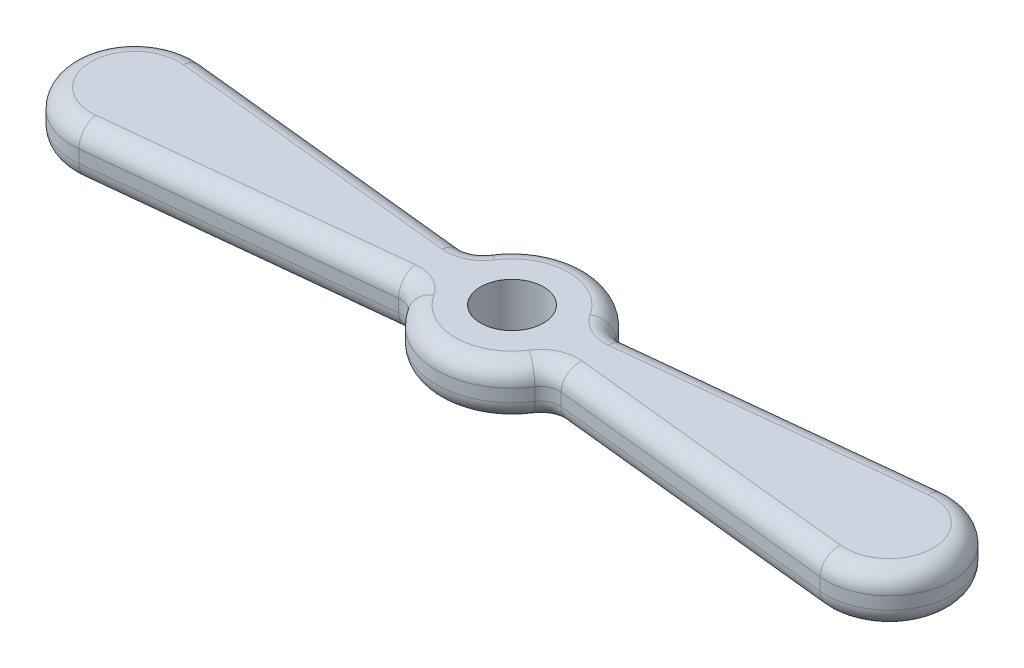
ISO-10303-21;
HEADER;
FILE_DESCRIPTION(('STEP AP214'),'2;1');
FILE_NAME('part.step','',(''),(''),'','','');
FILE_SCHEMA(('AUTOMOTIVE_DESIGN { 1 0 10303 214 1 1 1 1 }'));
ENDSEC;
DATA;
#1=APPLICATION_CONTEXT('core data for automotive mechanical design processes');
#2=APPLICATION_PROTOCOL_DEFINITION('international standard','automotive_design',2000,#1);
#3=PRODUCT_CONTEXT('',#1,'mechanical');
#4=PRODUCT('Part','Part','',(#3));
#5=PRODUCT_RELATED_PRODUCT_CATEGORY('part','',(#4));
#6=PRODUCT_DEFINITION_FORMATION('','',#4);
#7=PRODUCT_DEFINITION_CONTEXT('part definition',#1,'design');
#8=PRODUCT_DEFINITION('design','',#6,#7);
#9=PRODUCT_DEFINITION_SHAPE('','',#8);
#10=(LENGTH_UNIT() NAMED_UNIT(*) SI_UNIT(.MILLI.,.METRE.));
#11=(NAMED_UNIT(*) PLANE_ANGLE_UNIT() SI_UNIT($,.RADIAN.));
#12=(NAMED_UNIT(*) SI_UNIT($,.STERADIAN.) SOLID_ANGLE_UNIT());
#13=UNCERTAINTY_MEASURE_WITH_UNIT(LENGTH_MEASURE(1.E-05),#10,'distance_accuracy_value','');
#14=(GEOMETRIC_REPRESENTATION_CONTEXT(3) GLOBAL_UNCERTAINTY_ASSIGNED_CONTEXT((#13)) GLOBAL_UNIT_ASSIGNED_CONTEXT((#10,
#11,#12)) REPRESENTATION_CONTEXT('',''));
#15=CARTESIAN_POINT('',(0.,0.,0.));
#16=DIRECTION('',(0.,0.,1.));
#17=DIRECTION('',(1.,0.,0.));
#18=AXIS2_PLACEMENT_3D('',#15,#16,#17);
#19=CARTESIAN_POINT('',(-60.,8.,0.));
#20=DIRECTION('',(0.,1.,0.));
#21=DIRECTION('',(0.,0.,1.));
#22=AXIS2_PLACEMENT_3D('',#19,#20,#21);
#23=PLANE('',#22);
#24=DIRECTION('',(-0.994521895368273,0.,-0.104528463267654));
#25=VECTOR('',#24,1.);
#26=CARTESIAN_POINT('',(-59.2683007571264,8.,-6.96165326757791));
#27=LINE('',#26,#25);
#28=CARTESIAN_POINT('',(-13.2567762913648,8.,-2.12564717519607));
#29=VERTEX_POINT('',#28);
#30=CARTESIAN_POINT('',(-59.2683007571264,8.,-6.96165326757791));
#31=VERTEX_POINT('',#30);
#32=EDGE_CURVE('E65',#29,#31,#27,.T.);
#33=ORIENTED_EDGE('',*,*,#32,.T.);
#34=CARTESIAN_POINT('',(-60.,8.,0.));
#35=DIRECTION('',(0.,1.,0.));
#36=DIRECTION('',(0.,0.,1.));
#37=AXIS2_PLACEMENT_3D('',#34,#35,#36);
#38=CIRCLE('',#37,7.);
#39=CARTESIAN_POINT('',(-59.2683007571264,8.,6.96165326757791));
#40=VERTEX_POINT('',#39);
#41=EDGE_CURVE('E221',#31,#40,#38,.T.);
#42=ORIENTED_EDGE('',*,*,#41,.T.);
#43=DIRECTION('',(0.994521895368273,0.,-0.104528463267654));
#44=VECTOR('',#43,1.);
#45=CARTESIAN_POINT('',(-13.2567762913648,8.,2.12564717519607));
#46=LINE('',#45,#44);
#47=CARTESIAN_POINT('',(-13.2567762913648,8.,2.12564717519607));
#48=VERTEX_POINT('',#47);
#49=EDGE_CURVE('E248',#40,#48,#46,.T.);
#50=ORIENTED_EDGE('',*,*,#49,.T.);
#51=CARTESIAN_POINT('',(-12.6296055117589,8.,8.09277854740571));
#52=DIRECTION('',(0.,1.,0.));
#53=DIRECTION('',(0.,0.,1.));
#54=AXIS2_PLACEMENT_3D('',#51,#52,#53);
#55=CIRCLE('',#54,6.);
#56=CARTESIAN_POINT('',(-7.57776330705533,8.,4.85566712844343));
#57=VERTEX_POINT('',#56);
#58=EDGE_CURVE('E505',#48,#57,#55,.F.);
#59=ORIENTED_EDGE('',*,*,#58,.T.);
#60=CARTESIAN_POINT('',(0.,8.,0.));
#61=DIRECTION('',(0.,1.,0.));
#62=DIRECTION('',(0.,0.,1.));
#63=AXIS2_PLACEMENT_3D('',#60,#61,#62);
#64=CIRCLE('',#63,9.);
#65=CARTESIAN_POINT('',(7.57776330705532,8.,4.85566712844342));
#66=VERTEX_POINT('',#65);
#67=EDGE_CURVE('E508',#57,#66,#64,.T.);
#68=ORIENTED_EDGE('',*,*,#67,.T.);
#69=CARTESIAN_POINT('',(12.6296055117589,8.,8.09277854740571));
#70=DIRECTION('',(0.,1.,0.));
#71=DIRECTION('',(0.,0.,1.));
#72=AXIS2_PLACEMENT_3D('',#69,#70,#71);
#73=CIRCLE('',#72,6.);
#74=CARTESIAN_POINT('',(13.2567762913648,8.,2.12564717519607));
#75=VERTEX_POINT('',#74);
#76=EDGE_CURVE('E511',#66,#75,#73,.F.);
#77=ORIENTED_EDGE('',*,*,#76,.T.);
#78=DIRECTION('',(0.994521895368273,0.,0.104528463267654));
#79=VECTOR('',#78,1.);
#80=CARTESIAN_POINT('',(59.2683007571265,8.,6.96165326757792));
#81=LINE('',#80,#79);
#82=CARTESIAN_POINT('',(59.2683007571264,8.,6.96165326757791));
#83=VERTEX_POINT('',#82);
#84=EDGE_CURVE('E514',#75,#83,#81,.T.);
#85=ORIENTED_EDGE('',*,*,#84,.T.);
#86=CARTESIAN_POINT('',(60.,8.,0.));
#87=DIRECTION('',(0.,1.,0.));
#88=DIRECTION('',(0.,0.,1.));
#89=AXIS2_PLACEMENT_3D('',#86,#87,#88);
#90=CIRCLE('',#89,7.);
#91=CARTESIAN_POINT('',(59.2683007571264,8.,-6.96165326757791));
#92=VERTEX_POINT('',#91);
#93=EDGE_CURVE('E517',#83,#92,#90,.T.);
#94=ORIENTED_EDGE('',*,*,#93,.T.);
#95=DIRECTION('',(-0.994521895368273,0.,0.104528463267654));
#96=VECTOR('',#95,1.);
#97=CARTESIAN_POINT('',(13.2567762913648,8.,-2.12564717519607));
#98=LINE('',#97,#96);
#99=CARTESIAN_POINT('',(13.2567762913648,8.,-2.12564717519607));
#100=VERTEX_POINT('',#99);
#101=EDGE_CURVE('E520',#92,#100,#98,.T.);
#102=ORIENTED_EDGE('',*,*,#101,.T.);
#103=CARTESIAN_POINT('',(12.6296055117589,8.,-8.09277854740571));
#104=DIRECTION('',(0.,1.,0.));
#105=DIRECTION('',(0.,0.,1.));
#106=AXIS2_PLACEMENT_3D('',#103,#104,#105);
#107=CIRCLE('',#106,6.);
#108=CARTESIAN_POINT('',(7.57776330705533,8.,-4.85566712844343));
#109=VERTEX_POINT('',#108);
#110=EDGE_CURVE('E523',#100,#109,#107,.F.);
#111=ORIENTED_EDGE('',*,*,#110,.T.);
#112=CARTESIAN_POINT('',(0.,8.,0.));
#113=DIRECTION('',(0.,1.,0.));
#114=DIRECTION('',(0.,0.,1.));
#115=AXIS2_PLACEMENT_3D('',#112,#113,#114);
#116=CIRCLE('',#115,9.);
#117=CARTESIAN_POINT('',(-7.57776330705532,8.,-4.85566712844342));
#118=VERTEX_POINT('',#117);
#119=EDGE_CURVE('E526',#109,#118,#116,.T.);
#120=ORIENTED_EDGE('',*,*,#119,.T.);
#121=CARTESIAN_POINT('',(-12.6296055117589,8.,-8.09277854740571));
#122=DIRECTION('',(0.,1.,0.));
#123=DIRECTION('',(0.,0.,1.));
#124=AXIS2_PLACEMENT_3D('',#121,#122,#123);
#125=CIRCLE('',#124,6.);
#126=EDGE_CURVE('E70',#118,#29,#125,.F.);
#127=ORIENTED_EDGE('',*,*,#126,.T.);
#128=EDGE_LOOP('',(#33,#42,#50,#59,#68,#77,#85,#94,#102,#111,#120,#127));
#129=FACE_BOUND('',#128,.T.);
#130=CARTESIAN_POINT('',(0.,8.,0.));
#131=DIRECTION('',(0.,1.,0.));
#132=DIRECTION('',(0.,0.,1.));
#133=AXIS2_PLACEMENT_3D('',#130,#131,#132);
#134=CIRCLE('',#133,5.);
#135=CARTESIAN_POINT('',(0.,8.,5.));
#136=VERTEX_POINT('',#135);
#137=EDGE_CURVE('E358',#136,#136,#134,.T.);
#138=ORIENTED_EDGE('',*,*,#137,.F.);
#139=EDGE_LOOP('',(#138));
#140=FACE_BOUND('',#139,.T.);
#141=ADVANCED_FACE('F47',(#129,#140),#23,.T.);
#142=CARTESIAN_POINT('',(-60.,0.,0.));
#143=DIRECTION('',(0.,1.,0.));
#144=DIRECTION('',(0.,0.,1.));
#145=AXIS2_PLACEMENT_3D('',#142,#143,#144);
#146=PLANE('',#145);
#147=DIRECTION('',(0.994521895368273,0.,-0.104528463267654));
#148=VECTOR('',#147,1.);
#149=CARTESIAN_POINT('',(-59.2683007571264,0.,6.96165326757791));
#150=LINE('',#149,#148);
#151=CARTESIAN_POINT('',(-13.2567762913648,0.,2.12564717519606));
#152=VERTEX_POINT('',#151);
#153=CARTESIAN_POINT('',(-59.2683007571264,0.,6.96165326757791));
#154=VERTEX_POINT('',#153);
#155=EDGE_CURVE('E406',#152,#154,#150,.F.);
#156=ORIENTED_EDGE('',*,*,#155,.T.);
#157=CARTESIAN_POINT('',(-60.,0.,0.));
#158=DIRECTION('',(0.,1.,0.));
#159=DIRECTION('',(0.,0.,1.));
#160=AXIS2_PLACEMENT_3D('',#157,#158,#159);
#161=CIRCLE('',#160,7.);
#162=CARTESIAN_POINT('',(-59.2683007571264,0.,-6.96165326757791));
#163=VERTEX_POINT('',#162);
#164=EDGE_CURVE('E439',#154,#163,#161,.F.);
#165=ORIENTED_EDGE('',*,*,#164,.T.);
#166=DIRECTION('',(-0.994521895368273,0.,-0.104528463267654));
#167=VECTOR('',#166,1.);
#168=CARTESIAN_POINT('',(-59.2683007571264,0.,-6.96165326757791));
#169=LINE('',#168,#167);
#170=CARTESIAN_POINT('',(-13.2567762913648,0.,-2.12564717519607));
#171=VERTEX_POINT('',#170);
#172=EDGE_CURVE('E436',#163,#171,#169,.F.);
#173=ORIENTED_EDGE('',*,*,#172,.T.);
#174=CARTESIAN_POINT('',(-12.6296055117589,0.,-8.09277854740571));
#175=DIRECTION('',(0.,1.,0.));
#176=DIRECTION('',(0.,0.,1.));
#177=AXIS2_PLACEMENT_3D('',#174,#175,#176);
#178=CIRCLE('',#177,6.);
#179=CARTESIAN_POINT('',(-7.57776330705532,0.,-4.85566712844342));
#180=VERTEX_POINT('',#179);
#181=EDGE_CURVE('E433',#171,#180,#178,.T.);
#182=ORIENTED_EDGE('',*,*,#181,.T.);
#183=CARTESIAN_POINT('',(0.,0.,0.));
#184=DIRECTION('',(0.,1.,0.));
#185=DIRECTION('',(0.,0.,1.));
#186=AXIS2_PLACEMENT_3D('',#183,#184,#185);
#187=CIRCLE('',#186,9.);
#188=CARTESIAN_POINT('',(7.57776330705533,0.,-4.85566712844343));
#189=VERTEX_POINT('',#188);
#190=EDGE_CURVE('E430',#180,#189,#187,.F.);
#191=ORIENTED_EDGE('',*,*,#190,.T.);
#192=CARTESIAN_POINT('',(12.6296055117589,0.,-8.09277854740571));
#193=DIRECTION('',(0.,1.,0.));
#194=DIRECTION('',(0.,0.,1.));
#195=AXIS2_PLACEMENT_3D('',#192,#193,#194);
#196=CIRCLE('',#195,6.);
#197=CARTESIAN_POINT('',(13.2567762913648,0.,-2.12564717519606));
#198=VERTEX_POINT('',#197);
#199=EDGE_CURVE('E427',#189,#198,#196,.T.);
#200=ORIENTED_EDGE('',*,*,#199,.T.);
#201=DIRECTION('',(-0.994521895368273,0.,0.104528463267654));
#202=VECTOR('',#201,1.);
#203=CARTESIAN_POINT('',(-59.4205552869019,0.,5.51304818148767));
#204=LINE('',#203,#202);
#205=CARTESIAN_POINT('',(59.2683007571264,0.,-6.96165326757791));
#206=VERTEX_POINT('',#205);
#207=EDGE_CURVE('E424',#198,#206,#204,.F.);
#208=ORIENTED_EDGE('',*,*,#207,.T.);
#209=CARTESIAN_POINT('',(60.,0.,0.));
#210=DIRECTION('',(0.,1.,0.));
#211=DIRECTION('',(0.,0.,1.));
#212=AXIS2_PLACEMENT_3D('',#209,#210,#211);
#213=CIRCLE('',#212,7.);
#214=CARTESIAN_POINT('',(59.2683007571264,0.,6.96165326757791));
#215=VERTEX_POINT('',#214);
#216=EDGE_CURVE('E421',#206,#215,#213,.F.);
#217=ORIENTED_EDGE('',*,*,#216,.T.);
#218=DIRECTION('',(0.994521895368273,0.,0.104528463267654));
#219=VECTOR('',#218,1.);
#220=CARTESIAN_POINT('',(-59.4205552869019,0.,-5.51304818148767));
#221=LINE('',#220,#219);
#222=CARTESIAN_POINT('',(13.2567762913648,0.,2.12564717519607));
#223=VERTEX_POINT('',#222);
#224=EDGE_CURVE('E418',#215,#223,#221,.F.);
#225=ORIENTED_EDGE('',*,*,#224,.T.);
#226=CARTESIAN_POINT('',(12.6296055117589,0.,8.09277854740571));
#227=DIRECTION('',(0.,1.,0.));
#228=DIRECTION('',(0.,0.,1.));
#229=AXIS2_PLACEMENT_3D('',#226,#227,#228);
#230=CIRCLE('',#229,6.);
#231=CARTESIAN_POINT('',(7.57776330705532,0.,4.85566712844342));
#232=VERTEX_POINT('',#231);
#233=EDGE_CURVE('E415',#223,#232,#230,.T.);
#234=ORIENTED_EDGE('',*,*,#233,.T.);
#235=CARTESIAN_POINT('',(0.,0.,0.));
#236=DIRECTION('',(0.,1.,0.));
#237=DIRECTION('',(0.,0.,1.));
#238=AXIS2_PLACEMENT_3D('',#235,#236,#237);
#239=CIRCLE('',#238,9.);
#240=CARTESIAN_POINT('',(-7.57776330705533,0.,4.85566712844343));
#241=VERTEX_POINT('',#240);
#242=EDGE_CURVE('E412',#232,#241,#239,.F.);
#243=ORIENTED_EDGE('',*,*,#242,.T.);
#244=CARTESIAN_POINT('',(-12.6296055117589,0.,8.09277854740571));
#245=DIRECTION('',(0.,1.,0.));
#246=DIRECTION('',(0.,0.,1.));
#247=AXIS2_PLACEMENT_3D('',#244,#245,#246);
#248=CIRCLE('',#247,6.);
#249=EDGE_CURVE('E409',#241,#152,#248,.T.);
#250=ORIENTED_EDGE('',*,*,#249,.T.);
#251=EDGE_LOOP('',(#156,#165,#173,#182,#191,#200,#208,#217,#225,#234,#243,#250));
#252=FACE_BOUND('',#251,.T.);
#253=CARTESIAN_POINT('',(0.,0.,0.));
#254=DIRECTION('',(0.,1.,0.));
#255=DIRECTION('',(0.,0.,1.));
#256=AXIS2_PLACEMENT_3D('',#253,#254,#255);
#257=CIRCLE('',#256,5.);
#258=CARTESIAN_POINT('',(0.,0.,5.));
#259=VERTEX_POINT('',#258);
#260=EDGE_CURVE('E351',#259,#259,#257,.T.);
#261=ORIENTED_EDGE('',*,*,#260,.T.);
#262=EDGE_LOOP('',(#261));
#263=FACE_BOUND('',#262,.T.);
#264=ADVANCED_FACE('F600',(#252,#263),#146,.F.);
#265=CARTESIAN_POINT('',(-60.,8.,0.));
#266=DIRECTION('',(0.,-1.,0.));
#267=DIRECTION('',(0.,0.,-1.));
#268=AXIS2_PLACEMENT_3D('',#265,#266,#267);
#269=CYLINDRICAL_SURFACE('',#268,10.);
#270=DIRECTION('',(0.,-1.,0.));
#271=VECTOR('',#270,1.);
#272=CARTESIAN_POINT('',(-58.9547153673235,8.,-9.94521895368273));
#273=LINE('',#272,#271);
#274=CARTESIAN_POINT('',(-58.9547153673235,5.,-9.94521895368273));
#275=VERTEX_POINT('',#274);
#276=CARTESIAN_POINT('',(-58.9547153673235,3.,-9.94521895368273));
#277=VERTEX_POINT('',#276);
#278=EDGE_CURVE('E364',#275,#277,#273,.T.);
#279=ORIENTED_EDGE('',*,*,#278,.T.);
#280=CARTESIAN_POINT('',(-60.,3.,0.));
#281=DIRECTION('',(0.,1.,0.));
#282=DIRECTION('',(0.,0.,1.));
#283=AXIS2_PLACEMENT_3D('',#280,#281,#282);
#284=CIRCLE('',#283,10.);
#285=CARTESIAN_POINT('',(-58.9547153673235,3.,9.94521895368273));
#286=VERTEX_POINT('',#285);
#287=EDGE_CURVE('E232',#277,#286,#284,.T.);
#288=ORIENTED_EDGE('',*,*,#287,.T.);
#289=DIRECTION('',(0.,-1.,0.));
#290=VECTOR('',#289,1.);
#291=CARTESIAN_POINT('',(-58.9547153673235,8.,9.94521895368273));
#292=LINE('',#291,#290);
#293=CARTESIAN_POINT('',(-58.9547153673235,5.,9.94521895368273));
#294=VERTEX_POINT('',#293);
#295=EDGE_CURVE('E213',#294,#286,#292,.T.);
#296=ORIENTED_EDGE('',*,*,#295,.F.);
#297=CARTESIAN_POINT('',(-60.,5.,0.));
#298=DIRECTION('',(0.,1.,0.));
#299=DIRECTION('',(0.,0.,1.));
#300=AXIS2_PLACEMENT_3D('',#297,#298,#299);
#301=CIRCLE('',#300,10.);
#302=EDGE_CURVE('E229',#294,#275,#301,.F.);
#303=ORIENTED_EDGE('',*,*,#302,.T.);
#304=EDGE_LOOP('',(#279,#288,#296,#303));
#305=FACE_BOUND('',#304,.T.);
#306=ADVANCED_FACE('F228',(#305),#269,.T.);
#307=CARTESIAN_POINT('',(-58.9547153673235,8.,9.94521895368273));
#308=DIRECTION('',(-0.104528463267654,0.,-0.994521895368273));
#309=DIRECTION('',(-0.994521895368273,0.,0.104528463267654));
#310=AXIS2_PLACEMENT_3D('',#307,#308,#309);
#311=PLANE('',#310);
#312=ORIENTED_EDGE('',*,*,#295,.T.);
#313=DIRECTION('',(0.994521895368273,0.,-0.104528463267654));
#314=VECTOR('',#313,1.);
#315=CARTESIAN_POINT('',(-58.9547153673235,3.,9.94521895368273));
#316=LINE('',#315,#314);
#317=CARTESIAN_POINT('',(-12.9431909015618,3.,5.10921286130089));
#318=VERTEX_POINT('',#317);
#319=EDGE_CURVE('E11',#286,#318,#316,.T.);
#320=ORIENTED_EDGE('',*,*,#319,.T.);
#321=DIRECTION('',(0.,1.,0.));
#322=VECTOR('',#321,1.);
#323=CARTESIAN_POINT('',(-12.9431909015618,8.,5.10921286130089));
#324=LINE('',#323,#322);
#325=CARTESIAN_POINT('',(-12.9431909015618,5.,5.10921286130089));
#326=VERTEX_POINT('',#325);
#327=EDGE_CURVE('E215',#318,#326,#324,.T.);
#328=ORIENTED_EDGE('',*,*,#327,.T.);
#329=DIRECTION('',(0.994521895368273,0.,-0.104528463267654));
#330=VECTOR('',#329,1.);
#331=CARTESIAN_POINT('',(-58.9547153673235,5.,9.94521895368273));
#332=LINE('',#331,#330);
#333=EDGE_CURVE('E57',#326,#294,#332,.F.);
#334=ORIENTED_EDGE('',*,*,#333,.T.);
#335=EDGE_LOOP('',(#312,#320,#328,#334));
#336=FACE_BOUND('',#335,.T.);
#337=ADVANCED_FACE('F212',(#336),#311,.F.);
#338=CARTESIAN_POINT('',(0.,8.,0.));
#339=DIRECTION('',(0.,-1.,0.));
#340=DIRECTION('',(0.,0.,-1.));
#341=AXIS2_PLACEMENT_3D('',#338,#339,#340);
#342=CYLINDRICAL_SURFACE('',#341,12.);
#343=DIRECTION('',(0.,-1.,0.));
#344=VECTOR('',#343,1.);
#345=CARTESIAN_POINT('',(-10.1036844094071,8.,6.47422283792456));
#346=LINE('',#345,#344);
#347=CARTESIAN_POINT('',(-10.1036844094071,5.,6.47422283792456));
#348=VERTEX_POINT('',#347);
#349=CARTESIAN_POINT('',(-10.1036844094071,3.,6.47422283792456));
#350=VERTEX_POINT('',#349);
#351=EDGE_CURVE('E391',#348,#350,#346,.T.);
#352=ORIENTED_EDGE('',*,*,#351,.T.);
#353=CARTESIAN_POINT('',(0.,3.,0.));
#354=DIRECTION('',(0.,1.,0.));
#355=DIRECTION('',(0.,0.,1.));
#356=AXIS2_PLACEMENT_3D('',#353,#354,#355);
#357=CIRCLE('',#356,12.);
#358=CARTESIAN_POINT('',(10.1036844094071,3.,6.47422283792456));
#359=VERTEX_POINT('',#358);
#360=EDGE_CURVE('E494',#350,#359,#357,.T.);
#361=ORIENTED_EDGE('',*,*,#360,.T.);
#362=DIRECTION('',(0.,-1.,0.));
#363=VECTOR('',#362,1.);
#364=CARTESIAN_POINT('',(10.1036844094071,8.,6.47422283792456));
#365=LINE('',#364,#363);
#366=CARTESIAN_POINT('',(10.1036844094071,5.,6.47422283792456));
#367=VERTEX_POINT('',#366);
#368=EDGE_CURVE('E387',#359,#367,#365,.F.);
#369=ORIENTED_EDGE('',*,*,#368,.T.);
#370=CARTESIAN_POINT('',(0.,5.,0.));
#371=DIRECTION('',(0.,1.,0.));
#372=DIRECTION('',(0.,0.,1.));
#373=AXIS2_PLACEMENT_3D('',#370,#371,#372);
#374=CIRCLE('',#373,12.);
#375=EDGE_CURVE('E491',#367,#348,#374,.F.);
#376=ORIENTED_EDGE('',*,*,#375,.T.);
#377=EDGE_LOOP('',(#352,#361,#369,#376));
#378=FACE_BOUND('',#377,.T.);
#379=ADVANCED_FACE('F628',(#378),#342,.T.);
#380=CARTESIAN_POINT('',(58.9547153673235,8.,9.94521895368273));
#381=DIRECTION('',(0.104528463267654,0.,-0.994521895368273));
#382=DIRECTION('',(-0.994521895368273,0.,-0.104528463267654));
#383=AXIS2_PLACEMENT_3D('',#380,#381,#382);
#384=PLANE('',#383);
#385=DIRECTION('',(0.,1.,0.));
#386=VECTOR('',#385,1.);
#387=CARTESIAN_POINT('',(12.9431909015618,0.,5.10921286130089));
#388=LINE('',#387,#386);
#389=CARTESIAN_POINT('',(12.9431909015618,5.,5.10921286130089));
#390=VERTEX_POINT('',#389);
#391=CARTESIAN_POINT('',(12.9431909015618,3.,5.10921286130089));
#392=VERTEX_POINT('',#391);
#393=EDGE_CURVE('E245',#390,#392,#388,.F.);
#394=ORIENTED_EDGE('',*,*,#393,.T.);
#395=DIRECTION('',(0.994521895368273,0.,0.104528463267654));
#396=VECTOR('',#395,1.);
#397=CARTESIAN_POINT('',(58.9547153673235,3.,9.94521895368273));
#398=LINE('',#397,#396);
#399=CARTESIAN_POINT('',(58.9547153673235,3.,9.94521895368273));
#400=VERTEX_POINT('',#399);
#401=EDGE_CURVE('E482',#392,#400,#398,.T.);
#402=ORIENTED_EDGE('',*,*,#401,.T.);
#403=DIRECTION('',(0.,-1.,0.));
#404=VECTOR('',#403,1.);
#405=CARTESIAN_POINT('',(58.9547153673235,8.,9.94521895368273));
#406=LINE('',#405,#404);
#407=CARTESIAN_POINT('',(58.9547153673235,5.,9.94521895368273));
#408=VERTEX_POINT('',#407);
#409=EDGE_CURVE('E235',#408,#400,#406,.T.);
#410=ORIENTED_EDGE('',*,*,#409,.F.);
#411=DIRECTION('',(0.994521895368273,0.,0.104528463267654));
#412=VECTOR('',#411,1.);
#413=CARTESIAN_POINT('',(12.9431909015619,5.,5.10921286130089));
#414=LINE('',#413,#412);
#415=EDGE_CURVE('E479',#408,#390,#414,.F.);
#416=ORIENTED_EDGE('',*,*,#415,.T.);
#417=EDGE_LOOP('',(#394,#402,#410,#416));
#418=FACE_BOUND('',#417,.T.);
#419=ADVANCED_FACE('F624',(#418),#384,.F.);
#420=CARTESIAN_POINT('',(60.,8.,0.));
#421=DIRECTION('',(0.,-1.,0.));
#422=DIRECTION('',(0.,0.,-1.));
#423=AXIS2_PLACEMENT_3D('',#420,#421,#422);
#424=CYLINDRICAL_SURFACE('',#423,10.);
#425=ORIENTED_EDGE('',*,*,#409,.T.);
#426=CARTESIAN_POINT('',(60.,3.,0.));
#427=DIRECTION('',(0.,1.,0.));
#428=DIRECTION('',(0.,0.,1.));
#429=AXIS2_PLACEMENT_3D('',#426,#427,#428);
#430=CIRCLE('',#429,10.);
#431=CARTESIAN_POINT('',(58.9547153673235,3.,-9.94521895368273));
#432=VERTEX_POINT('',#431);
#433=EDGE_CURVE('E476',#400,#432,#430,.T.);
#434=ORIENTED_EDGE('',*,*,#433,.T.);
#435=DIRECTION('',(0.,-1.,0.));
#436=VECTOR('',#435,1.);
#437=CARTESIAN_POINT('',(58.9547153673235,8.,-9.94521895368273));
#438=LINE('',#437,#436);
#439=CARTESIAN_POINT('',(58.9547153673235,5.,-9.94521895368273));
#440=VERTEX_POINT('',#439);
#441=EDGE_CURVE('E369',#440,#432,#438,.T.);
#442=ORIENTED_EDGE('',*,*,#441,.F.);
#443=CARTESIAN_POINT('',(60.,5.,0.));
#444=DIRECTION('',(0.,1.,0.));
#445=DIRECTION('',(0.,0.,1.));
#446=AXIS2_PLACEMENT_3D('',#443,#444,#445);
#447=CIRCLE('',#446,10.);
#448=EDGE_CURVE('E473',#440,#408,#447,.F.);
#449=ORIENTED_EDGE('',*,*,#448,.T.);
#450=EDGE_LOOP('',(#425,#434,#442,#449));
#451=FACE_BOUND('',#450,.T.);
#452=ADVANCED_FACE('F620',(#451),#424,.T.);
#453=CARTESIAN_POINT('',(58.9547153673235,8.,-9.94521895368273));
#454=DIRECTION('',(0.104528463267654,0.,0.994521895368273));
#455=DIRECTION('',(0.994521895368273,0.,-0.104528463267654));
#456=AXIS2_PLACEMENT_3D('',#453,#454,#455);
#457=PLANE('',#456);
#458=ORIENTED_EDGE('',*,*,#441,.T.);
#459=DIRECTION('',(-0.994521895368273,0.,0.104528463267654));
#460=VECTOR('',#459,1.);
#461=CARTESIAN_POINT('',(58.9547153673235,3.,-9.94521895368273));
#462=LINE('',#461,#460);
#463=CARTESIAN_POINT('',(12.9431909015618,3.,-5.10921286130089));
#464=VERTEX_POINT('',#463);
#465=EDGE_CURVE('E470',#432,#464,#462,.T.);
#466=ORIENTED_EDGE('',*,*,#465,.T.);
#467=DIRECTION('',(0.,1.,0.));
#468=VECTOR('',#467,1.);
#469=CARTESIAN_POINT('',(12.9431909015618,8.,-5.10921286130089));
#470=LINE('',#469,#468);
#471=CARTESIAN_POINT('',(12.9431909015618,5.,-5.10921286130089));
#472=VERTEX_POINT('',#471);
#473=EDGE_CURVE('E397',#464,#472,#470,.T.);
#474=ORIENTED_EDGE('',*,*,#473,.T.);
#475=DIRECTION('',(-0.994521895368273,0.,0.104528463267654));
#476=VECTOR('',#475,1.);
#477=CARTESIAN_POINT('',(58.9547153673235,5.,-9.94521895368274));
#478=LINE('',#477,#476);
#479=EDGE_CURVE('E467',#472,#440,#478,.F.);
#480=ORIENTED_EDGE('',*,*,#479,.T.);
#481=EDGE_LOOP('',(#458,#466,#474,#480));
#482=FACE_BOUND('',#481,.T.);
#483=ADVANCED_FACE('F616',(#482),#457,.F.);
#484=CARTESIAN_POINT('',(0.,8.,0.));
#485=DIRECTION('',(0.,-1.,0.));
#486=DIRECTION('',(0.,0.,-1.));
#487=AXIS2_PLACEMENT_3D('',#484,#485,#486);
#488=CYLINDRICAL_SURFACE('',#487,12.);
#489=DIRECTION('',(0.,-1.,0.));
#490=VECTOR('',#489,1.);
#491=CARTESIAN_POINT('',(10.1036844094071,8.,-6.47422283792456));
#492=LINE('',#491,#490);
#493=CARTESIAN_POINT('',(10.1036844094071,5.,-6.47422283792456));
#494=VERTEX_POINT('',#493);
#495=CARTESIAN_POINT('',(10.1036844094071,3.,-6.47422283792456));
#496=VERTEX_POINT('',#495);
#497=EDGE_CURVE('E379',#494,#496,#492,.T.);
#498=ORIENTED_EDGE('',*,*,#497,.T.);
#499=CARTESIAN_POINT('',(0.,3.,0.));
#500=DIRECTION('',(0.,1.,0.));
#501=DIRECTION('',(0.,0.,1.));
#502=AXIS2_PLACEMENT_3D('',#499,#500,#501);
#503=CIRCLE('',#502,12.);
#504=CARTESIAN_POINT('',(-10.1036844094071,3.,-6.47422283792456));
#505=VERTEX_POINT('',#504);
#506=EDGE_CURVE('E458',#496,#505,#503,.T.);
#507=ORIENTED_EDGE('',*,*,#506,.T.);
#508=DIRECTION('',(0.,-1.,0.));
#509=VECTOR('',#508,1.);
#510=CARTESIAN_POINT('',(-10.1036844094071,8.,-6.47422283792456));
#511=LINE('',#510,#509);
#512=CARTESIAN_POINT('',(-10.1036844094071,5.,-6.47422283792456));
#513=VERTEX_POINT('',#512);
#514=EDGE_CURVE('E383',#505,#513,#511,.F.);
#515=ORIENTED_EDGE('',*,*,#514,.T.);
#516=CARTESIAN_POINT('',(0.,5.,0.));
#517=DIRECTION('',(0.,1.,0.));
#518=DIRECTION('',(0.,0.,1.));
#519=AXIS2_PLACEMENT_3D('',#516,#517,#518);
#520=CIRCLE('',#519,12.);
#521=EDGE_CURVE('E455',#513,#494,#520,.F.);
#522=ORIENTED_EDGE('',*,*,#521,.T.);
#523=EDGE_LOOP('',(#498,#507,#515,#522));
#524=FACE_BOUND('',#523,.T.);
#525=ADVANCED_FACE('F613',(#524),#488,.T.);
#526=CARTESIAN_POINT('',(-58.9547153673235,8.,-9.94521895368273));
#527=DIRECTION('',(-0.104528463267654,0.,0.994521895368273));
#528=DIRECTION('',(0.994521895368273,0.,0.104528463267654));
#529=AXIS2_PLACEMENT_3D('',#526,#527,#528);
#530=PLANE('',#529);
#531=DIRECTION('',(0.,1.,0.));
#532=VECTOR('',#531,1.);
#533=CARTESIAN_POINT('',(-12.9431909015618,0.,-5.10921286130089));
#534=LINE('',#533,#532);
#535=CARTESIAN_POINT('',(-12.9431909015618,5.,-5.10921286130089));
#536=VERTEX_POINT('',#535);
#537=CARTESIAN_POINT('',(-12.9431909015618,3.,-5.10921286130089));
#538=VERTEX_POINT('',#537);
#539=EDGE_CURVE('E234',#536,#538,#534,.F.);
#540=ORIENTED_EDGE('',*,*,#539,.T.);
#541=DIRECTION('',(-0.994521895368273,0.,-0.104528463267654));
#542=VECTOR('',#541,1.);
#543=CARTESIAN_POINT('',(-58.9547153673235,3.,-9.94521895368273));
#544=LINE('',#543,#542);
#545=EDGE_CURVE('E446',#538,#277,#544,.T.);
#546=ORIENTED_EDGE('',*,*,#545,.T.);
#547=ORIENTED_EDGE('',*,*,#278,.F.);
#548=DIRECTION('',(-0.994521895368273,0.,-0.104528463267654));
#549=VECTOR('',#548,1.);
#550=CARTESIAN_POINT('',(-12.9431909015618,5.,-5.10921286130089));
#551=LINE('',#550,#549);
#552=EDGE_CURVE('E443',#275,#536,#551,.F.);
#553=ORIENTED_EDGE('',*,*,#552,.T.);
#554=EDGE_LOOP('',(#540,#546,#547,#553));
#555=FACE_BOUND('',#554,.T.);
#556=ADVANCED_FACE('F573',(#555),#530,.F.);
#557=CARTESIAN_POINT('',(0.,8.,0.));
#558=DIRECTION('',(0.,-1.,0.));
#559=DIRECTION('',(0.,0.,-1.));
#560=AXIS2_PLACEMENT_3D('',#557,#558,#559);
#561=CYLINDRICAL_SURFACE('',#560,5.);
#562=ORIENTED_EDGE('',*,*,#137,.T.);
#563=EDGE_LOOP('',(#562));
#564=FACE_BOUND('',#563,.T.);
#565=ORIENTED_EDGE('',*,*,#260,.F.);
#566=EDGE_LOOP('',(#565));
#567=FACE_BOUND('',#566,.T.);
#568=ADVANCED_FACE('F609',(#564,#567),#561,.F.);
#569=CARTESIAN_POINT('',(-12.6296055117589,8.,-8.09277854740571));
#570=DIRECTION('',(0.,-1.,0.));
#571=DIRECTION('',(0.,0.,-1.));
#572=AXIS2_PLACEMENT_3D('',#569,#570,#571);
#573=CYLINDRICAL_SURFACE('',#572,3.);
#574=ORIENTED_EDGE('',*,*,#514,.F.);
#575=CARTESIAN_POINT('',(-12.6296055117589,3.,-8.09277854740571));
#576=DIRECTION('',(0.,1.,0.));
#577=DIRECTION('',(0.,0.,1.));
#578=AXIS2_PLACEMENT_3D('',#575,#576,#577);
#579=CIRCLE('',#578,3.);
#580=EDGE_CURVE('E452',#505,#538,#579,.F.);
#581=ORIENTED_EDGE('',*,*,#580,.T.);
#582=ORIENTED_EDGE('',*,*,#539,.F.);
#583=CARTESIAN_POINT('',(-12.6296055117589,5.,-8.09277854740571));
#584=DIRECTION('',(0.,1.,0.));
#585=DIRECTION('',(0.,0.,1.));
#586=AXIS2_PLACEMENT_3D('',#583,#584,#585);
#587=CIRCLE('',#586,3.);
#588=EDGE_CURVE('E449',#536,#513,#587,.T.);
#589=ORIENTED_EDGE('',*,*,#588,.T.);
#590=EDGE_LOOP('',(#574,#581,#582,#589));
#591=FACE_BOUND('',#590,.T.);
#592=ADVANCED_FACE('F577',(#591),#573,.F.);
#593=CARTESIAN_POINT('',(-12.6296055117589,8.,8.09277854740571));
#594=DIRECTION('',(0.,-1.,0.));
#595=DIRECTION('',(0.,0.,-1.));
#596=AXIS2_PLACEMENT_3D('',#593,#594,#595);
#597=CYLINDRICAL_SURFACE('',#596,3.);
#598=ORIENTED_EDGE('',*,*,#327,.F.);
#599=CARTESIAN_POINT('',(-12.6296055117589,3.,8.09277854740571));
#600=DIRECTION('',(0.,1.,0.));
#601=DIRECTION('',(0.,0.,1.));
#602=AXIS2_PLACEMENT_3D('',#599,#600,#601);
#603=CIRCLE('',#602,3.);
#604=EDGE_CURVE('E500',#318,#350,#603,.F.);
#605=ORIENTED_EDGE('',*,*,#604,.T.);
#606=ORIENTED_EDGE('',*,*,#351,.F.);
#607=CARTESIAN_POINT('',(-12.6296055117589,5.,8.09277854740571));
#608=DIRECTION('',(0.,1.,0.));
#609=DIRECTION('',(0.,0.,1.));
#610=AXIS2_PLACEMENT_3D('',#607,#608,#609);
#611=CIRCLE('',#610,3.);
#612=EDGE_CURVE('E497',#348,#326,#611,.T.);
#613=ORIENTED_EDGE('',*,*,#612,.T.);
#614=EDGE_LOOP('',(#598,#605,#606,#613));
#615=FACE_BOUND('',#614,.T.);
#616=ADVANCED_FACE('F639',(#615),#597,.F.);
#617=CARTESIAN_POINT('',(12.6296055117589,8.,-8.09277854740571));
#618=DIRECTION('',(0.,-1.,0.));
#619=DIRECTION('',(0.,0.,-1.));
#620=AXIS2_PLACEMENT_3D('',#617,#618,#619);
#621=CYLINDRICAL_SURFACE('',#620,3.);
#622=ORIENTED_EDGE('',*,*,#473,.F.);
#623=CARTESIAN_POINT('',(12.6296055117589,3.,-8.09277854740571));
#624=DIRECTION('',(0.,1.,0.));
#625=DIRECTION('',(0.,0.,1.));
#626=AXIS2_PLACEMENT_3D('',#623,#624,#625);
#627=CIRCLE('',#626,3.);
#628=EDGE_CURVE('E464',#464,#496,#627,.F.);
#629=ORIENTED_EDGE('',*,*,#628,.T.);
#630=ORIENTED_EDGE('',*,*,#497,.F.);
#631=CARTESIAN_POINT('',(12.6296055117589,5.,-8.09277854740571));
#632=DIRECTION('',(0.,1.,0.));
#633=DIRECTION('',(0.,0.,1.));
#634=AXIS2_PLACEMENT_3D('',#631,#632,#633);
#635=CIRCLE('',#634,3.);
#636=EDGE_CURVE('E461',#494,#472,#635,.T.);
#637=ORIENTED_EDGE('',*,*,#636,.T.);
#638=EDGE_LOOP('',(#622,#629,#630,#637));
#639=FACE_BOUND('',#638,.T.);
#640=ADVANCED_FACE('F642',(#639),#621,.F.);
#641=CARTESIAN_POINT('',(12.6296055117589,8.,8.09277854740571));
#642=DIRECTION('',(0.,-1.,0.));
#643=DIRECTION('',(0.,0.,-1.));
#644=AXIS2_PLACEMENT_3D('',#641,#642,#643);
#645=CYLINDRICAL_SURFACE('',#644,3.);
#646=ORIENTED_EDGE('',*,*,#368,.F.);
#647=CARTESIAN_POINT('',(12.6296055117589,3.,8.09277854740571));
#648=DIRECTION('',(0.,1.,0.));
#649=DIRECTION('',(0.,0.,1.));
#650=AXIS2_PLACEMENT_3D('',#647,#648,#649);
#651=CIRCLE('',#650,3.);
#652=EDGE_CURVE('E488',#359,#392,#651,.F.);
#653=ORIENTED_EDGE('',*,*,#652,.T.);
#654=ORIENTED_EDGE('',*,*,#393,.F.);
#655=CARTESIAN_POINT('',(12.6296055117589,5.,8.09277854740571));
#656=DIRECTION('',(0.,1.,0.));
#657=DIRECTION('',(0.,0.,1.));
#658=AXIS2_PLACEMENT_3D('',#655,#656,#657);
#659=CIRCLE('',#658,3.);
#660=EDGE_CURVE('E485',#390,#367,#659,.T.);
#661=ORIENTED_EDGE('',*,*,#660,.T.);
#662=EDGE_LOOP('',(#646,#653,#654,#661));
#663=FACE_BOUND('',#662,.T.);
#664=ADVANCED_FACE('F645',(#663),#645,.F.);
#665=CARTESIAN_POINT('',(60.,3.,0.));
#666=DIRECTION('',(0.,1.,0.));
#667=DIRECTION('',(0.,0.,1.));
#668=AXIS2_PLACEMENT_3D('',#665,#666,#667);
#669=TOROIDAL_SURFACE('',#668,7.,3.);
#670=CARTESIAN_POINT('',(59.2683007571264,3.,6.96165326757791));
#671=DIRECTION('',(-0.994521895368273,0.,-0.104528463267653));
#672=DIRECTION('',(-0.104528463267653,0.,0.994521895368273));
#673=AXIS2_PLACEMENT_3D('',#670,#671,#672);
#674=CIRCLE('',#673,3.);
#675=EDGE_CURVE('E342',#215,#400,#674,.T.);
#676=ORIENTED_EDGE('',*,*,#675,.F.);
#677=ORIENTED_EDGE('',*,*,#216,.F.);
#678=CARTESIAN_POINT('',(59.2683007571264,3.,-6.96165326757791));
#679=DIRECTION('',(-0.994521895368273,0.,0.104528463267653));
#680=DIRECTION('',(0.104528463267653,0.,0.994521895368274));
#681=AXIS2_PLACEMENT_3D('',#678,#679,#680);
#682=CIRCLE('',#681,3.);
#683=EDGE_CURVE('E255',#432,#206,#682,.T.);
#684=ORIENTED_EDGE('',*,*,#683,.F.);
#685=ORIENTED_EDGE('',*,*,#433,.F.);
#686=EDGE_LOOP('',(#676,#677,#684,#685));
#687=FACE_BOUND('',#686,.T.);
#688=ADVANCED_FACE('F648',(#687),#669,.T.);
#689=CARTESIAN_POINT('',(59.2683007571264,3.,-6.96165326757791));
#690=DIRECTION('',(-0.994521895368273,0.,0.104528463267654));
#691=DIRECTION('',(0.104528463267654,0.,0.994521895368273));
#692=AXIS2_PLACEMENT_3D('',#689,#690,#691);
#693=CYLINDRICAL_SURFACE('',#692,3.);
#694=ORIENTED_EDGE('',*,*,#683,.T.);
#695=ORIENTED_EDGE('',*,*,#207,.F.);
#696=CARTESIAN_POINT('',(13.2567762913648,3.,-2.12564717519606));
#697=DIRECTION('',(-0.994521895368273,0.,0.104528463267654));
#698=DIRECTION('',(0.104528463267654,0.,0.994521895368274));
#699=AXIS2_PLACEMENT_3D('',#696,#697,#698);
#700=CIRCLE('',#699,3.);
#701=EDGE_CURVE('E339',#464,#198,#700,.T.);
#702=ORIENTED_EDGE('',*,*,#701,.F.);
#703=ORIENTED_EDGE('',*,*,#465,.F.);
#704=EDGE_LOOP('',(#694,#695,#702,#703));
#705=FACE_BOUND('',#704,.T.);
#706=ADVANCED_FACE('F653',(#705),#693,.T.);
#707=CARTESIAN_POINT('',(59.2683007571264,3.,6.96165326757791));
#708=DIRECTION('',(0.994521895368273,0.,0.104528463267654));
#709=DIRECTION('',(0.104528463267654,0.,-0.994521895368273));
#710=AXIS2_PLACEMENT_3D('',#707,#708,#709);
#711=CYLINDRICAL_SURFACE('',#710,3.);
#712=ORIENTED_EDGE('',*,*,#675,.T.);
#713=ORIENTED_EDGE('',*,*,#401,.F.);
#714=CARTESIAN_POINT('',(13.2567762913648,3.,2.12564717519607));
#715=DIRECTION('',(-0.994521895368273,0.,-0.104528463267654));
#716=DIRECTION('',(-0.104528463267654,0.,0.994521895368274));
#717=AXIS2_PLACEMENT_3D('',#714,#715,#716);
#718=CIRCLE('',#717,3.);
#719=EDGE_CURVE('E335',#223,#392,#718,.T.);
#720=ORIENTED_EDGE('',*,*,#719,.F.);
#721=ORIENTED_EDGE('',*,*,#224,.F.);
#722=EDGE_LOOP('',(#712,#713,#720,#721));
#723=FACE_BOUND('',#722,.T.);
#724=ADVANCED_FACE('F672',(#723),#711,.T.);
#725=CARTESIAN_POINT('',(12.6296055117589,3.,-8.09277854740571));
#726=DIRECTION('',(0.,1.,0.));
#727=DIRECTION('',(0.,0.,1.));
#728=AXIS2_PLACEMENT_3D('',#725,#726,#727);
#729=TOROIDAL_SURFACE('',#728,6.,3.);
#730=ORIENTED_EDGE('',*,*,#701,.T.);
#731=ORIENTED_EDGE('',*,*,#199,.F.);
#732=CARTESIAN_POINT('',(7.57776330705533,3.,-4.85566712844342));
#733=DIRECTION('',(-0.539518569827047,0.,-0.841973700783924));
#734=DIRECTION('',(-0.841973700783924,0.,0.539518569827047));
#735=AXIS2_PLACEMENT_3D('',#732,#733,#734);
#736=CIRCLE('',#735,3.);
#737=EDGE_CURVE('E331',#496,#189,#736,.T.);
#738=ORIENTED_EDGE('',*,*,#737,.F.);
#739=ORIENTED_EDGE('',*,*,#628,.F.);
#740=EDGE_LOOP('',(#730,#731,#738,#739));
#741=FACE_BOUND('',#740,.T.);
#742=ADVANCED_FACE('F684',(#741),#729,.T.);
#743=CARTESIAN_POINT('',(12.6296055117589,3.,8.09277854740571));
#744=DIRECTION('',(0.,1.,0.));
#745=DIRECTION('',(0.,0.,1.));
#746=AXIS2_PLACEMENT_3D('',#743,#744,#745);
#747=TOROIDAL_SURFACE('',#746,6.,3.);
#748=ORIENTED_EDGE('',*,*,#719,.T.);
#749=ORIENTED_EDGE('',*,*,#652,.F.);
#750=CARTESIAN_POINT('',(7.57776330705533,3.,4.85566712844342));
#751=DIRECTION('',(-0.539518569827047,0.,0.841973700783925));
#752=DIRECTION('',(0.841973700783925,0.,0.539518569827047));
#753=AXIS2_PLACEMENT_3D('',#750,#751,#752);
#754=CIRCLE('',#753,3.);
#755=EDGE_CURVE('E327',#232,#359,#754,.T.);
#756=ORIENTED_EDGE('',*,*,#755,.F.);
#757=ORIENTED_EDGE('',*,*,#233,.F.);
#758=EDGE_LOOP('',(#748,#749,#756,#757));
#759=FACE_BOUND('',#758,.T.);
#760=ADVANCED_FACE('F661',(#759),#747,.T.);
#761=CARTESIAN_POINT('',(0.,3.,0.));
#762=DIRECTION('',(0.,1.,0.));
#763=DIRECTION('',(0.,0.,1.));
#764=AXIS2_PLACEMENT_3D('',#761,#762,#763);
#765=TOROIDAL_SURFACE('',#764,9.,3.);
#766=ORIENTED_EDGE('',*,*,#737,.T.);
#767=ORIENTED_EDGE('',*,*,#190,.F.);
#768=CARTESIAN_POINT('',(-7.57776330705532,3.,-4.85566712844342));
#769=DIRECTION('',(-0.539518569827047,0.,0.841973700783925));
#770=DIRECTION('',(0.841973700783925,0.,0.539518569827047));
#771=AXIS2_PLACEMENT_3D('',#768,#769,#770);
#772=CIRCLE('',#771,3.);
#773=EDGE_CURVE('E323',#505,#180,#772,.T.);
#774=ORIENTED_EDGE('',*,*,#773,.F.);
#775=ORIENTED_EDGE('',*,*,#506,.F.);
#776=EDGE_LOOP('',(#766,#767,#774,#775));
#777=FACE_BOUND('',#776,.T.);
#778=ADVANCED_FACE('F687',(#777),#765,.T.);
#779=CARTESIAN_POINT('',(0.,3.,0.));
#780=DIRECTION('',(0.,1.,0.));
#781=DIRECTION('',(0.,0.,1.));
#782=AXIS2_PLACEMENT_3D('',#779,#780,#781);
#783=TOROIDAL_SURFACE('',#782,9.,3.);
#784=ORIENTED_EDGE('',*,*,#755,.T.);
#785=ORIENTED_EDGE('',*,*,#360,.F.);
#786=CARTESIAN_POINT('',(-7.57776330705532,3.,4.85566712844342));
#787=DIRECTION('',(-0.539518569827047,0.,-0.841973700783925));
#788=DIRECTION('',(-0.841973700783925,0.,0.539518569827047));
#789=AXIS2_PLACEMENT_3D('',#786,#787,#788);
#790=CIRCLE('',#789,3.);
#791=EDGE_CURVE('E319',#241,#350,#790,.T.);
#792=ORIENTED_EDGE('',*,*,#791,.F.);
#793=ORIENTED_EDGE('',*,*,#242,.F.);
#794=EDGE_LOOP('',(#784,#785,#792,#793));
#795=FACE_BOUND('',#794,.T.);
#796=ADVANCED_FACE('F667',(#795),#783,.T.);
#797=CARTESIAN_POINT('',(-12.6296055117589,3.,-8.09277854740571));
#798=DIRECTION('',(0.,1.,0.));
#799=DIRECTION('',(0.,0.,1.));
#800=AXIS2_PLACEMENT_3D('',#797,#798,#799);
#801=TOROIDAL_SURFACE('',#800,6.,3.);
#802=ORIENTED_EDGE('',*,*,#773,.T.);
#803=ORIENTED_EDGE('',*,*,#181,.F.);
#804=CARTESIAN_POINT('',(-13.2567762913648,3.,-2.12564717519607));
#805=DIRECTION('',(-0.994521895368273,0.,-0.104528463267654));
#806=DIRECTION('',(-0.104528463267654,0.,0.994521895368274));
#807=AXIS2_PLACEMENT_3D('',#804,#805,#806);
#808=CIRCLE('',#807,3.);
#809=EDGE_CURVE('E315',#538,#171,#808,.T.);
#810=ORIENTED_EDGE('',*,*,#809,.F.);
#811=ORIENTED_EDGE('',*,*,#580,.F.);
#812=EDGE_LOOP('',(#802,#803,#810,#811));
#813=FACE_BOUND('',#812,.T.);
#814=ADVANCED_FACE('F581',(#813),#801,.T.);
#815=CARTESIAN_POINT('',(-12.6296055117589,3.,8.09277854740571));
#816=DIRECTION('',(0.,1.,0.));
#817=DIRECTION('',(0.,0.,1.));
#818=AXIS2_PLACEMENT_3D('',#815,#816,#817);
#819=TOROIDAL_SURFACE('',#818,6.,3.);
#820=ORIENTED_EDGE('',*,*,#791,.T.);
#821=ORIENTED_EDGE('',*,*,#604,.F.);
#822=CARTESIAN_POINT('',(-13.2567762913648,3.,2.12564717519607));
#823=DIRECTION('',(-0.994521895368273,0.,0.104528463267654));
#824=DIRECTION('',(0.104528463267654,0.,0.994521895368274));
#825=AXIS2_PLACEMENT_3D('',#822,#823,#824);
#826=CIRCLE('',#825,3.);
#827=EDGE_CURVE('E309',#152,#318,#826,.T.);
#828=ORIENTED_EDGE('',*,*,#827,.F.);
#829=ORIENTED_EDGE('',*,*,#249,.F.);
#830=EDGE_LOOP('',(#820,#821,#828,#829));
#831=FACE_BOUND('',#830,.T.);
#832=ADVANCED_FACE('F692',(#831),#819,.T.);
#833=CARTESIAN_POINT('',(-59.2683007571264,3.,-6.96165326757791));
#834=DIRECTION('',(-0.994521895368273,0.,-0.104528463267654));
#835=DIRECTION('',(-0.104528463267654,0.,0.994521895368273));
#836=AXIS2_PLACEMENT_3D('',#833,#834,#835);
#837=CYLINDRICAL_SURFACE('',#836,3.);
#838=ORIENTED_EDGE('',*,*,#809,.T.);
#839=ORIENTED_EDGE('',*,*,#172,.F.);
#840=CARTESIAN_POINT('',(-59.2683007571264,3.,-6.96165326757791));
#841=DIRECTION('',(-0.994521895368273,0.,-0.104528463267653));
#842=DIRECTION('',(-0.104528463267653,0.,0.994521895368274));
#843=AXIS2_PLACEMENT_3D('',#840,#841,#842);
#844=CIRCLE('',#843,3.);
#845=EDGE_CURVE('E302',#277,#163,#844,.T.);
#846=ORIENTED_EDGE('',*,*,#845,.F.);
#847=ORIENTED_EDGE('',*,*,#545,.F.);
#848=EDGE_LOOP('',(#838,#839,#846,#847));
#849=FACE_BOUND('',#848,.T.);
#850=ADVANCED_FACE('F587',(#849),#837,.T.);
#851=CARTESIAN_POINT('',(-59.2683007571264,3.,6.96165326757791));
#852=DIRECTION('',(0.994521895368273,0.,-0.104528463267654));
#853=DIRECTION('',(-0.104528463267654,0.,-0.994521895368273));
#854=AXIS2_PLACEMENT_3D('',#851,#852,#853);
#855=CYLINDRICAL_SURFACE('',#854,3.);
#856=ORIENTED_EDGE('',*,*,#827,.T.);
#857=ORIENTED_EDGE('',*,*,#319,.F.);
#858=CARTESIAN_POINT('',(-59.2683007571264,3.,6.96165326757791));
#859=DIRECTION('',(-0.994521895368273,0.,0.104528463267653));
#860=DIRECTION('',(0.104528463267653,0.,0.994521895368274));
#861=AXIS2_PLACEMENT_3D('',#858,#859,#860);
#862=CIRCLE('',#861,3.);
#863=EDGE_CURVE('E296',#154,#286,#862,.T.);
#864=ORIENTED_EDGE('',*,*,#863,.F.);
#865=ORIENTED_EDGE('',*,*,#155,.F.);
#866=EDGE_LOOP('',(#856,#857,#864,#865));
#867=FACE_BOUND('',#866,.T.);
#868=ADVANCED_FACE('F590',(#867),#855,.T.);
#869=CARTESIAN_POINT('',(-60.,3.,0.));
#870=DIRECTION('',(0.,1.,0.));
#871=DIRECTION('',(0.,0.,1.));
#872=AXIS2_PLACEMENT_3D('',#869,#870,#871);
#873=TOROIDAL_SURFACE('',#872,7.,3.);
#874=ORIENTED_EDGE('',*,*,#845,.T.);
#875=ORIENTED_EDGE('',*,*,#164,.F.);
#876=ORIENTED_EDGE('',*,*,#863,.T.);
#877=ORIENTED_EDGE('',*,*,#287,.F.);
#878=EDGE_LOOP('',(#874,#875,#876,#877));
#879=FACE_BOUND('',#878,.T.);
#880=ADVANCED_FACE('F588',(#879),#873,.T.);
#881=CARTESIAN_POINT('',(60.,5.,0.));
#882=DIRECTION('',(0.,1.,0.));
#883=DIRECTION('',(0.,0.,1.));
#884=AXIS2_PLACEMENT_3D('',#881,#882,#883);
#885=TOROIDAL_SURFACE('',#884,7.,3.);
#886=CARTESIAN_POINT('',(59.2683007571264,5.,6.96165326757791));
#887=DIRECTION('',(-0.994521895368273,0.,-0.104528463267653));
#888=DIRECTION('',(-0.104528463267653,0.,0.994521895368274));
#889=AXIS2_PLACEMENT_3D('',#886,#887,#888);
#890=CIRCLE('',#889,3.);
#891=EDGE_CURVE('E287',#408,#83,#890,.T.);
#892=ORIENTED_EDGE('',*,*,#891,.F.);
#893=ORIENTED_EDGE('',*,*,#448,.F.);
#894=CARTESIAN_POINT('',(59.2683007571264,5.,-6.96165326757791));
#895=DIRECTION('',(-0.994521895368273,0.,0.104528463267653));
#896=DIRECTION('',(0.104528463267653,0.,0.994521895368273));
#897=AXIS2_PLACEMENT_3D('',#894,#895,#896);
#898=CIRCLE('',#897,3.);
#899=EDGE_CURVE('E51',#92,#440,#898,.T.);
#900=ORIENTED_EDGE('',*,*,#899,.F.);
#901=ORIENTED_EDGE('',*,*,#93,.F.);
#902=EDGE_LOOP('',(#892,#893,#900,#901));
#903=FACE_BOUND('',#902,.T.);
#904=ADVANCED_FACE('F49',(#903),#885,.T.);
#905=CARTESIAN_POINT('',(-59.4205552869019,5.,5.51304818148767));
#906=DIRECTION('',(0.994521895368273,0.,-0.104528463267654));
#907=DIRECTION('',(-0.104528463267654,0.,-0.994521895368273));
#908=AXIS2_PLACEMENT_3D('',#905,#906,#907);
#909=CYLINDRICAL_SURFACE('',#908,3.);
#910=ORIENTED_EDGE('',*,*,#899,.T.);
#911=ORIENTED_EDGE('',*,*,#479,.F.);
#912=CARTESIAN_POINT('',(13.2567762913648,5.,-2.12564717519607));
#913=DIRECTION('',(-0.994521895368273,0.,0.104528463267654));
#914=DIRECTION('',(0.104528463267654,0.,0.994521895368274));
#915=AXIS2_PLACEMENT_3D('',#912,#913,#914);
#916=CIRCLE('',#915,3.);
#917=EDGE_CURVE('E284',#100,#472,#916,.T.);
#918=ORIENTED_EDGE('',*,*,#917,.F.);
#919=ORIENTED_EDGE('',*,*,#101,.F.);
#920=EDGE_LOOP('',(#910,#911,#918,#919));
#921=FACE_BOUND('',#920,.T.);
#922=ADVANCED_FACE('F555',(#921),#909,.T.);
#923=CARTESIAN_POINT('',(-59.4205552869019,5.,-5.51304818148767));
#924=DIRECTION('',(-0.994521895368273,0.,-0.104528463267654));
#925=DIRECTION('',(-0.104528463267654,0.,0.994521895368273));
#926=AXIS2_PLACEMENT_3D('',#923,#924,#925);
#927=CYLINDRICAL_SURFACE('',#926,3.);
#928=ORIENTED_EDGE('',*,*,#891,.T.);
#929=ORIENTED_EDGE('',*,*,#84,.F.);
#930=CARTESIAN_POINT('',(13.2567762913648,5.,2.12564717519606));
#931=DIRECTION('',(-0.994521895368273,0.,-0.104528463267654));
#932=DIRECTION('',(-0.104528463267654,0.,0.994521895368274));
#933=AXIS2_PLACEMENT_3D('',#930,#931,#932);
#934=CIRCLE('',#933,3.);
#935=EDGE_CURVE('E280',#390,#75,#934,.T.);
#936=ORIENTED_EDGE('',*,*,#935,.F.);
#937=ORIENTED_EDGE('',*,*,#415,.F.);
#938=EDGE_LOOP('',(#928,#929,#936,#937));
#939=FACE_BOUND('',#938,.T.);
#940=ADVANCED_FACE('F550',(#939),#927,.T.);
#941=CARTESIAN_POINT('',(12.6296055117589,5.,-8.09277854740571));
#942=DIRECTION('',(0.,1.,0.));
#943=DIRECTION('',(0.,0.,1.));
#944=AXIS2_PLACEMENT_3D('',#941,#942,#943);
#945=TOROIDAL_SURFACE('',#944,6.,3.);
#946=ORIENTED_EDGE('',*,*,#917,.T.);
#947=ORIENTED_EDGE('',*,*,#636,.F.);
#948=CARTESIAN_POINT('',(7.57776330705533,5.,-4.85566712844343));
#949=DIRECTION('',(-0.539518569827047,0.,-0.841973700783925));
#950=DIRECTION('',(-0.841973700783925,0.,0.539518569827047));
#951=AXIS2_PLACEMENT_3D('',#948,#949,#950);
#952=CIRCLE('',#951,3.);
#953=EDGE_CURVE('E276',#109,#494,#952,.T.);
#954=ORIENTED_EDGE('',*,*,#953,.F.);
#955=ORIENTED_EDGE('',*,*,#110,.F.);
#956=EDGE_LOOP('',(#946,#947,#954,#955));
#957=FACE_BOUND('',#956,.T.);
#958=ADVANCED_FACE('F562',(#957),#945,.T.);
#959=CARTESIAN_POINT('',(12.6296055117589,5.,8.09277854740571));
#960=DIRECTION('',(0.,1.,0.));
#961=DIRECTION('',(0.,0.,1.));
#962=AXIS2_PLACEMENT_3D('',#959,#960,#961);
#963=TOROIDAL_SURFACE('',#962,6.,3.);
#964=ORIENTED_EDGE('',*,*,#935,.T.);
#965=ORIENTED_EDGE('',*,*,#76,.F.);
#966=CARTESIAN_POINT('',(7.57776330705533,5.,4.85566712844342));
#967=DIRECTION('',(-0.539518569827047,0.,0.841973700783924));
#968=DIRECTION('',(0.841973700783924,0.,0.539518569827047));
#969=AXIS2_PLACEMENT_3D('',#966,#967,#968);
#970=CIRCLE('',#969,3.);
#971=EDGE_CURVE('E272',#367,#66,#970,.T.);
#972=ORIENTED_EDGE('',*,*,#971,.F.);
#973=ORIENTED_EDGE('',*,*,#660,.F.);
#974=EDGE_LOOP('',(#964,#965,#972,#973));
#975=FACE_BOUND('',#974,.T.);
#976=ADVANCED_FACE('F547',(#975),#963,.T.);
#977=CARTESIAN_POINT('',(0.,5.,0.));
#978=DIRECTION('',(0.,1.,0.));
#979=DIRECTION('',(0.,0.,1.));
#980=AXIS2_PLACEMENT_3D('',#977,#978,#979);
#981=TOROIDAL_SURFACE('',#980,9.,3.);
#982=ORIENTED_EDGE('',*,*,#953,.T.);
#983=ORIENTED_EDGE('',*,*,#521,.F.);
#984=CARTESIAN_POINT('',(-7.57776330705532,5.,-4.85566712844342));
#985=DIRECTION('',(-0.539518569827047,0.,0.841973700783924));
#986=DIRECTION('',(0.841973700783924,0.,0.539518569827047));
#987=AXIS2_PLACEMENT_3D('',#984,#985,#986);
#988=CIRCLE('',#987,3.);
#989=EDGE_CURVE('E268',#118,#513,#988,.T.);
#990=ORIENTED_EDGE('',*,*,#989,.F.);
#991=ORIENTED_EDGE('',*,*,#119,.F.);
#992=EDGE_LOOP('',(#982,#983,#990,#991));
#993=FACE_BOUND('',#992,.T.);
#994=ADVANCED_FACE('F565',(#993),#981,.T.);
#995=CARTESIAN_POINT('',(0.,5.,0.));
#996=DIRECTION('',(0.,1.,0.));
#997=DIRECTION('',(0.,0.,1.));
#998=AXIS2_PLACEMENT_3D('',#995,#996,#997);
#999=TOROIDAL_SURFACE('',#998,9.,3.);
#1000=ORIENTED_EDGE('',*,*,#971,.T.);
#1001=ORIENTED_EDGE('',*,*,#67,.F.);
#1002=CARTESIAN_POINT('',(-7.57776330705532,5.,4.85566712844342));
#1003=DIRECTION('',(-0.539518569827047,0.,-0.841973700783925));
#1004=DIRECTION('',(-0.841973700783925,0.,0.539518569827047));
#1005=AXIS2_PLACEMENT_3D('',#1002,#1003,#1004);
#1006=CIRCLE('',#1005,3.);
#1007=EDGE_CURVE('E264',#348,#57,#1006,.T.);
#1008=ORIENTED_EDGE('',*,*,#1007,.F.);
#1009=ORIENTED_EDGE('',*,*,#375,.F.);
#1010=EDGE_LOOP('',(#1000,#1001,#1008,#1009));
#1011=FACE_BOUND('',#1010,.T.);
#1012=ADVANCED_FACE('F543',(#1011),#999,.T.);
#1013=CARTESIAN_POINT('',(-12.6296055117589,5.,-8.09277854740571));
#1014=DIRECTION('',(0.,1.,0.));
#1015=DIRECTION('',(0.,0.,1.));
#1016=AXIS2_PLACEMENT_3D('',#1013,#1014,#1015);
#1017=TOROIDAL_SURFACE('',#1016,6.,3.);
#1018=ORIENTED_EDGE('',*,*,#989,.T.);
#1019=ORIENTED_EDGE('',*,*,#588,.F.);
#1020=CARTESIAN_POINT('',(-13.2567762913648,5.,-2.12564717519607));
#1021=DIRECTION('',(-0.994521895368273,0.,-0.104528463267654));
#1022=DIRECTION('',(-0.104528463267654,0.,0.994521895368274));
#1023=AXIS2_PLACEMENT_3D('',#1020,#1021,#1022);
#1024=CIRCLE('',#1023,3.);
#1025=EDGE_CURVE('E260',#29,#536,#1024,.T.);
#1026=ORIENTED_EDGE('',*,*,#1025,.F.);
#1027=ORIENTED_EDGE('',*,*,#126,.F.);
#1028=EDGE_LOOP('',(#1018,#1019,#1026,#1027));
#1029=FACE_BOUND('',#1028,.T.);
#1030=ADVANCED_FACE('F568',(#1029),#1017,.T.);
#1031=CARTESIAN_POINT('',(-12.6296055117589,5.,8.09277854740571));
#1032=DIRECTION('',(0.,1.,0.));
#1033=DIRECTION('',(0.,0.,1.));
#1034=AXIS2_PLACEMENT_3D('',#1031,#1032,#1033);
#1035=TOROIDAL_SURFACE('',#1034,6.,3.);
#1036=ORIENTED_EDGE('',*,*,#1007,.T.);
#1037=ORIENTED_EDGE('',*,*,#58,.F.);
#1038=CARTESIAN_POINT('',(-13.2567762913648,5.,2.12564717519607));
#1039=DIRECTION('',(-0.994521895368273,0.,0.104528463267654));
#1040=DIRECTION('',(0.104528463267654,0.,0.994521895368274));
#1041=AXIS2_PLACEMENT_3D('',#1038,#1039,#1040);
#1042=CIRCLE('',#1041,3.);
#1043=EDGE_CURVE('E252',#326,#48,#1042,.T.);
#1044=ORIENTED_EDGE('',*,*,#1043,.F.);
#1045=ORIENTED_EDGE('',*,*,#612,.F.);
#1046=EDGE_LOOP('',(#1036,#1037,#1044,#1045));
#1047=FACE_BOUND('',#1046,.T.);
#1048=ADVANCED_FACE('F538',(#1047),#1035,.T.);
#1049=CARTESIAN_POINT('',(-59.2683007571264,5.,-6.96165326757791));
#1050=DIRECTION('',(0.994521895368273,0.,0.104528463267654));
#1051=DIRECTION('',(0.104528463267654,0.,-0.994521895368273));
#1052=AXIS2_PLACEMENT_3D('',#1049,#1050,#1051);
#1053=CYLINDRICAL_SURFACE('',#1052,3.);
#1054=ORIENTED_EDGE('',*,*,#1025,.T.);
#1055=ORIENTED_EDGE('',*,*,#552,.F.);
#1056=CARTESIAN_POINT('',(-59.2683007571264,5.,-6.96165326757791));
#1057=DIRECTION('',(-0.994521895368273,0.,-0.104528463267653));
#1058=DIRECTION('',(-0.104528463267653,0.,0.994521895368274));
#1059=AXIS2_PLACEMENT_3D('',#1056,#1057,#1058);
#1060=CIRCLE('',#1059,3.);
#1061=EDGE_CURVE('E242',#31,#275,#1060,.T.);
#1062=ORIENTED_EDGE('',*,*,#1061,.F.);
#1063=ORIENTED_EDGE('',*,*,#32,.F.);
#1064=EDGE_LOOP('',(#1054,#1055,#1062,#1063));
#1065=FACE_BOUND('',#1064,.T.);
#1066=ADVANCED_FACE('F570',(#1065),#1053,.T.);
#1067=CARTESIAN_POINT('',(-59.2683007571264,5.,6.96165326757791));
#1068=DIRECTION('',(-0.994521895368273,0.,0.104528463267654));
#1069=DIRECTION('',(0.104528463267654,0.,0.994521895368273));
#1070=AXIS2_PLACEMENT_3D('',#1067,#1068,#1069);
#1071=CYLINDRICAL_SURFACE('',#1070,3.);
#1072=ORIENTED_EDGE('',*,*,#1043,.T.);
#1073=ORIENTED_EDGE('',*,*,#49,.F.);
#1074=CARTESIAN_POINT('',(-59.2683007571264,5.,6.96165326757791));
#1075=DIRECTION('',(-0.994521895368273,0.,0.104528463267653));
#1076=DIRECTION('',(0.104528463267653,0.,0.994521895368274));
#1077=AXIS2_PLACEMENT_3D('',#1074,#1075,#1076);
#1078=CIRCLE('',#1077,3.);
#1079=EDGE_CURVE('E240',#294,#40,#1078,.T.);
#1080=ORIENTED_EDGE('',*,*,#1079,.F.);
#1081=ORIENTED_EDGE('',*,*,#333,.F.);
#1082=EDGE_LOOP('',(#1072,#1073,#1080,#1081));
#1083=FACE_BOUND('',#1082,.T.);
#1084=ADVANCED_FACE('F247',(#1083),#1071,.T.);
#1085=CARTESIAN_POINT('',(-60.,5.,0.));
#1086=DIRECTION('',(0.,1.,0.));
#1087=DIRECTION('',(0.,0.,1.));
#1088=AXIS2_PLACEMENT_3D('',#1085,#1086,#1087);
#1089=TOROIDAL_SURFACE('',#1088,7.,3.);
#1090=ORIENTED_EDGE('',*,*,#1061,.T.);
#1091=ORIENTED_EDGE('',*,*,#302,.F.);
#1092=ORIENTED_EDGE('',*,*,#1079,.T.);
#1093=ORIENTED_EDGE('',*,*,#41,.F.);
#1094=EDGE_LOOP('',(#1090,#1091,#1092,#1093));
#1095=FACE_BOUND('',#1094,.T.);
#1096=ADVANCED_FACE('F238',(#1095),#1089,.T.);
#1097=CLOSED_SHELL('',(#141,#264,#306,#337,#379,#419,#452,#483,#525,#556,#568,#592,#616,#640,
#664,#688,#706,#724,#742,#760,#778,#796,#814,#832,#850,#868,#880,#904,#922,#940,#958,#976,#994,
#1012,#1030,#1048,#1066,#1084,#1096));
#1098=MANIFOLD_SOLID_BREP('B2',#1097);
#1099=ADVANCED_BREP_SHAPE_REPRESENTATION('',(#18,#1098),#14);
#1100=SHAPE_DEFINITION_REPRESENTATION(#9,#1099);
ENDSEC;
END-ISO-10303-21;
